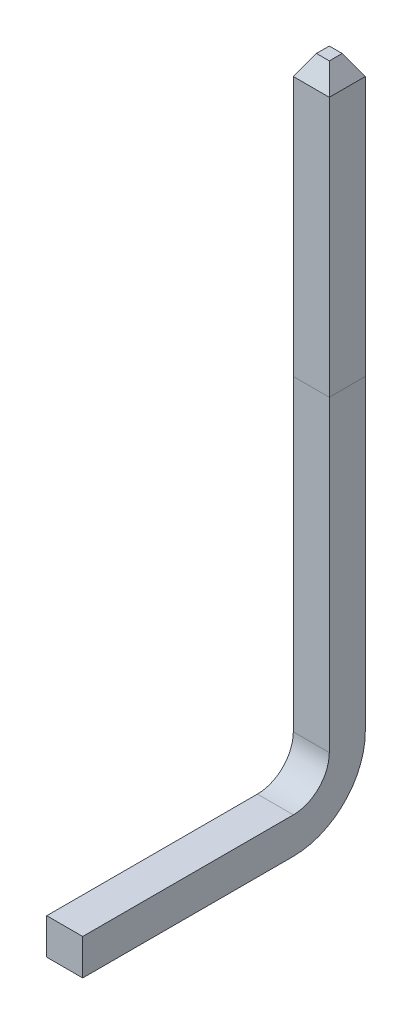
ISO-10303-21;
HEADER;
FILE_DESCRIPTION(('STEP AP214'),'2;1');
FILE_NAME('part.step','',(''),(''),'','','');
FILE_SCHEMA(('AUTOMOTIVE_DESIGN { 1 0 10303 214 1 1 1 1 }'));
ENDSEC;
DATA;
#1=APPLICATION_CONTEXT('core data for automotive mechanical design processes');
#2=APPLICATION_PROTOCOL_DEFINITION('international standard','automotive_design',2000,#1);
#3=PRODUCT_CONTEXT('',#1,'mechanical');
#4=PRODUCT('Part','Part','',(#3));
#5=PRODUCT_RELATED_PRODUCT_CATEGORY('part','',(#4));
#6=PRODUCT_DEFINITION_FORMATION('','',#4);
#7=PRODUCT_DEFINITION_CONTEXT('part definition',#1,'design');
#8=PRODUCT_DEFINITION('design','',#6,#7);
#9=PRODUCT_DEFINITION_SHAPE('','',#8);
#10=(LENGTH_UNIT() NAMED_UNIT(*) SI_UNIT(.MILLI.,.METRE.));
#11=(NAMED_UNIT(*) PLANE_ANGLE_UNIT() SI_UNIT($,.RADIAN.));
#12=(NAMED_UNIT(*) SI_UNIT($,.STERADIAN.) SOLID_ANGLE_UNIT());
#13=UNCERTAINTY_MEASURE_WITH_UNIT(LENGTH_MEASURE(1.E-05),#10,'distance_accuracy_value','');
#14=(GEOMETRIC_REPRESENTATION_CONTEXT(3) GLOBAL_UNCERTAINTY_ASSIGNED_CONTEXT((#13)) GLOBAL_UNIT_ASSIGNED_CONTEXT((#10,
#11,#12)) REPRESENTATION_CONTEXT('',''));
#15=CARTESIAN_POINT('',(0.,0.,0.));
#16=DIRECTION('',(0.,0.,1.));
#17=DIRECTION('',(1.,0.,0.));
#18=AXIS2_PLACEMENT_3D('',#15,#16,#17);
#19=CARTESIAN_POINT('',(0.945261,4.20515324442206,-8.33901828310207));
#20=DIRECTION('',(0.,0.,1.));
#21=DIRECTION('',(0.,-1.,0.));
#22=AXIS2_PLACEMENT_3D('',#19,#20,#21);
#23=PLANE('',#22);
#24=DIRECTION('',(-1.,0.,0.));
#25=VECTOR('',#24,1.);
#26=CARTESIAN_POINT('',(0.945261,10.6006192444221,-8.33901828310206));
#27=LINE('',#26,#25);
#28=CARTESIAN_POINT('',(0.945261,10.6006192444221,-8.33901828310206));
#29=VERTEX_POINT('',#28);
#30=CARTESIAN_POINT('',(0.197739,10.6006192444221,-8.33901828310206));
#31=VERTEX_POINT('',#30);
#32=EDGE_CURVE('E170',#29,#31,#27,.T.);
#33=ORIENTED_EDGE('',*,*,#32,.F.);
#34=DIRECTION('',(0.,1.,0.));
#35=VECTOR('',#34,1.);
#36=CARTESIAN_POINT('',(0.945261,4.20515324442206,-8.33901828310207));
#37=LINE('',#36,#35);
#38=CARTESIAN_POINT('',(0.945261,4.20515324442206,-8.33901828310207));
#39=VERTEX_POINT('',#38);
#40=EDGE_CURVE('E233',#39,#29,#37,.T.);
#41=ORIENTED_EDGE('',*,*,#40,.F.);
#42=DIRECTION('',(-1.,0.,0.));
#43=VECTOR('',#42,1.);
#44=CARTESIAN_POINT('',(0.945261,4.20515324442206,-8.33901828310207));
#45=LINE('',#44,#43);
#46=CARTESIAN_POINT('',(0.197739,4.20515324442206,-8.33901828310207));
#47=VERTEX_POINT('',#46);
#48=EDGE_CURVE('E162',#39,#47,#45,.T.);
#49=ORIENTED_EDGE('',*,*,#48,.T.);
#50=DIRECTION('',(0.,1.,0.));
#51=VECTOR('',#50,1.);
#52=CARTESIAN_POINT('',(0.197739,4.20515324442206,-8.33901828310207));
#53=LINE('',#52,#51);
#54=EDGE_CURVE('E212',#47,#31,#53,.T.);
#55=ORIENTED_EDGE('',*,*,#54,.T.);
#56=EDGE_LOOP('',(#33,#41,#49,#55));
#57=FACE_BOUND('',#56,.T.);
#58=ADVANCED_FACE('F40',(#57),#23,.F.);
#59=CARTESIAN_POINT('',(0.197739,4.20515324442206,-6.84397428310207));
#60=DIRECTION('',(1.,0.,0.));
#61=DIRECTION('',(0.,0.,-1.));
#62=AXIS2_PLACEMENT_3D('',#59,#60,#61);
#63=PLANE('',#62);
#64=DIRECTION('',(0.,0.,1.));
#65=VECTOR('',#64,1.);
#66=CARTESIAN_POINT('',(0.197739,10.6006192444221,-6.84397428310207));
#67=LINE('',#66,#65);
#68=CARTESIAN_POINT('',(0.197739,10.6006192444221,-7.59149628310206));
#69=VERTEX_POINT('',#68);
#70=EDGE_CURVE('E169',#31,#69,#67,.T.);
#71=ORIENTED_EDGE('',*,*,#70,.F.);
#72=ORIENTED_EDGE('',*,*,#54,.F.);
#73=CARTESIAN_POINT('',(0.197739,4.20515324442206,-6.84397428310207));
#74=DIRECTION('',(1.,0.,0.));
#75=DIRECTION('',(0.,0.,-1.));
#76=AXIS2_PLACEMENT_3D('',#73,#74,#75);
#77=CIRCLE('',#76,1.495044);
#78=CARTESIAN_POINT('',(0.197739,2.71010924442206,-6.84397428310207));
#79=VERTEX_POINT('',#78);
#80=EDGE_CURVE('E205',#79,#47,#77,.T.);
#81=ORIENTED_EDGE('',*,*,#80,.F.);
#82=DIRECTION('',(0.,0.,-1.));
#83=VECTOR('',#82,1.);
#84=CARTESIAN_POINT('',(0.197739,2.71010924442206,-2.46681768310206));
#85=LINE('',#84,#83);
#86=CARTESIAN_POINT('',(0.197739,2.71010924442206,-2.46681768310206));
#87=VERTEX_POINT('',#86);
#88=EDGE_CURVE('E203',#87,#79,#85,.T.);
#89=ORIENTED_EDGE('',*,*,#88,.F.);
#90=DIRECTION('',(0.,-1.,0.));
#91=VECTOR('',#90,1.);
#92=CARTESIAN_POINT('',(0.197739,3.45763124442206,-2.46681768310206));
#93=LINE('',#92,#91);
#94=CARTESIAN_POINT('',(0.197739,3.45763124442206,-2.46681768310206));
#95=VERTEX_POINT('',#94);
#96=EDGE_CURVE('E155',#95,#87,#93,.T.);
#97=ORIENTED_EDGE('',*,*,#96,.F.);
#98=DIRECTION('',(0.,0.,1.));
#99=VECTOR('',#98,1.);
#100=CARTESIAN_POINT('',(0.197739,3.45763124442206,-6.84397428310207));
#101=LINE('',#100,#99);
#102=CARTESIAN_POINT('',(0.197739,3.45763124442206,-6.84397428310207));
#103=VERTEX_POINT('',#102);
#104=EDGE_CURVE('E151',#103,#95,#101,.T.);
#105=ORIENTED_EDGE('',*,*,#104,.F.);
#106=CARTESIAN_POINT('',(0.197739,4.20515324442206,-6.84397428310207));
#107=DIRECTION('',(-1.,0.,0.));
#108=DIRECTION('',(0.,0.,-1.));
#109=AXIS2_PLACEMENT_3D('',#106,#107,#108);
#110=CIRCLE('',#109,0.747521999999998);
#111=CARTESIAN_POINT('',(0.197739,4.20515324442206,-7.59149628310206));
#112=VERTEX_POINT('',#111);
#113=EDGE_CURVE('E218',#112,#103,#110,.T.);
#114=ORIENTED_EDGE('',*,*,#113,.F.);
#115=DIRECTION('',(0.,-1.,0.));
#116=VECTOR('',#115,1.);
#117=CARTESIAN_POINT('',(0.197739,16.4146792444221,-7.59149628310206));
#118=LINE('',#117,#116);
#119=EDGE_CURVE('E215',#69,#112,#118,.T.);
#120=ORIENTED_EDGE('',*,*,#119,.F.);
#121=EDGE_LOOP('',(#71,#72,#81,#89,#97,#105,#114,#120));
#122=FACE_BOUND('',#121,.T.);
#123=ADVANCED_FACE('F238',(#122),#63,.F.);
#124=CARTESIAN_POINT('',(0.945261,16.4146792444221,-7.59149628310206));
#125=DIRECTION('',(0.,0.,-1.));
#126=DIRECTION('',(0.,1.,0.));
#127=AXIS2_PLACEMENT_3D('',#124,#125,#126);
#128=PLANE('',#127);
#129=DIRECTION('',(1.,0.,0.));
#130=VECTOR('',#129,1.);
#131=CARTESIAN_POINT('',(0.945261,10.6006192444221,-7.59149628310206));
#132=LINE('',#131,#130);
#133=CARTESIAN_POINT('',(0.945261,10.6006192444221,-7.59149628310206));
#134=VERTEX_POINT('',#133);
#135=EDGE_CURVE('E160',#69,#134,#132,.T.);
#136=ORIENTED_EDGE('',*,*,#135,.F.);
#137=ORIENTED_EDGE('',*,*,#119,.T.);
#138=DIRECTION('',(-1.,0.,0.));
#139=VECTOR('',#138,1.);
#140=CARTESIAN_POINT('',(0.945261,4.20515324442206,-7.59149628310206));
#141=LINE('',#140,#139);
#142=CARTESIAN_POINT('',(0.945261,4.20515324442206,-7.59149628310206));
#143=VERTEX_POINT('',#142);
#144=EDGE_CURVE('E226',#143,#112,#141,.T.);
#145=ORIENTED_EDGE('',*,*,#144,.F.);
#146=DIRECTION('',(0.,-1.,0.));
#147=VECTOR('',#146,1.);
#148=CARTESIAN_POINT('',(0.945261,16.4146792444221,-7.59149628310206));
#149=LINE('',#148,#147);
#150=EDGE_CURVE('E421',#134,#143,#149,.T.);
#151=ORIENTED_EDGE('',*,*,#150,.F.);
#152=EDGE_LOOP('',(#136,#137,#145,#151));
#153=FACE_BOUND('',#152,.T.);
#154=ADVANCED_FACE('F272',(#153),#128,.F.);
#155=CARTESIAN_POINT('',(0.945261,4.20515324442206,-6.84397428310207));
#156=DIRECTION('',(1.,0.,0.));
#157=DIRECTION('',(0.,0.,-1.));
#158=AXIS2_PLACEMENT_3D('',#155,#156,#157);
#159=PLANE('',#158);
#160=ORIENTED_EDGE('',*,*,#40,.T.);
#161=DIRECTION('',(0.,0.,1.));
#162=VECTOR('',#161,1.);
#163=CARTESIAN_POINT('',(0.945261,10.6006192444221,-6.84397428310207));
#164=LINE('',#163,#162);
#165=EDGE_CURVE('E156',#29,#134,#164,.T.);
#166=ORIENTED_EDGE('',*,*,#165,.T.);
#167=ORIENTED_EDGE('',*,*,#150,.T.);
#168=CARTESIAN_POINT('',(0.945261,4.20515324442206,-6.84397428310207));
#169=DIRECTION('',(-1.,0.,0.));
#170=DIRECTION('',(0.,0.,-1.));
#171=AXIS2_PLACEMENT_3D('',#168,#169,#170);
#172=CIRCLE('',#171,0.747521999999998);
#173=CARTESIAN_POINT('',(0.945261,3.45763124442206,-6.84397428310207));
#174=VERTEX_POINT('',#173);
#175=EDGE_CURVE('E428',#143,#174,#172,.T.);
#176=ORIENTED_EDGE('',*,*,#175,.T.);
#177=DIRECTION('',(0.,0.,1.));
#178=VECTOR('',#177,1.);
#179=CARTESIAN_POINT('',(0.945261,3.45763124442206,-6.84397428310207));
#180=LINE('',#179,#178);
#181=CARTESIAN_POINT('',(0.945261,3.45763124442206,-2.46681768310206));
#182=VERTEX_POINT('',#181);
#183=EDGE_CURVE('E147',#174,#182,#180,.T.);
#184=ORIENTED_EDGE('',*,*,#183,.T.);
#185=DIRECTION('',(0.,-1.,0.));
#186=VECTOR('',#185,1.);
#187=CARTESIAN_POINT('',(0.945261,3.45763124442206,-2.46681768310206));
#188=LINE('',#187,#186);
#189=CARTESIAN_POINT('',(0.945261,2.71010924442206,-2.46681768310206));
#190=VERTEX_POINT('',#189);
#191=EDGE_CURVE('E141',#182,#190,#188,.T.);
#192=ORIENTED_EDGE('',*,*,#191,.T.);
#193=DIRECTION('',(0.,0.,-1.));
#194=VECTOR('',#193,1.);
#195=CARTESIAN_POINT('',(0.945261,2.71010924442206,-2.46681768310206));
#196=LINE('',#195,#194);
#197=CARTESIAN_POINT('',(0.945261,2.71010924442206,-6.84397428310207));
#198=VERTEX_POINT('',#197);
#199=EDGE_CURVE('E130',#190,#198,#196,.T.);
#200=ORIENTED_EDGE('',*,*,#199,.T.);
#201=CARTESIAN_POINT('',(0.945261,4.20515324442206,-6.84397428310207));
#202=DIRECTION('',(1.,0.,0.));
#203=DIRECTION('',(0.,0.,-1.));
#204=AXIS2_PLACEMENT_3D('',#201,#202,#203);
#205=CIRCLE('',#204,1.495044);
#206=EDGE_CURVE('E140',#198,#39,#205,.T.);
#207=ORIENTED_EDGE('',*,*,#206,.T.);
#208=EDGE_LOOP('',(#160,#166,#167,#176,#184,#192,#200,#207));
#209=FACE_BOUND('',#208,.T.);
#210=ADVANCED_FACE('F145',(#209),#159,.T.);
#211=CARTESIAN_POINT('',(0.945261,3.45763124442206,-2.46681768310206));
#212=DIRECTION('',(0.,0.,-1.));
#213=DIRECTION('',(-1.,0.,0.));
#214=AXIS2_PLACEMENT_3D('',#211,#212,#213);
#215=PLANE('',#214);
#216=ORIENTED_EDGE('',*,*,#96,.T.);
#217=DIRECTION('',(-1.,0.,0.));
#218=VECTOR('',#217,1.);
#219=CARTESIAN_POINT('',(0.945261,2.71010924442206,-2.46681768310206));
#220=LINE('',#219,#218);
#221=EDGE_CURVE('E134',#190,#87,#220,.T.);
#222=ORIENTED_EDGE('',*,*,#221,.F.);
#223=ORIENTED_EDGE('',*,*,#191,.F.);
#224=DIRECTION('',(-1.,0.,0.));
#225=VECTOR('',#224,1.);
#226=CARTESIAN_POINT('',(0.945261,3.45763124442206,-2.46681768310206));
#227=LINE('',#226,#225);
#228=EDGE_CURVE('E221',#182,#95,#227,.T.);
#229=ORIENTED_EDGE('',*,*,#228,.T.);
#230=EDGE_LOOP('',(#216,#222,#223,#229));
#231=FACE_BOUND('',#230,.T.);
#232=ADVANCED_FACE('F153',(#231),#215,.F.);
#233=CARTESIAN_POINT('',(0.945261,2.71010924442206,-2.46681768310206));
#234=DIRECTION('',(0.,1.,0.));
#235=DIRECTION('',(0.,0.,1.));
#236=AXIS2_PLACEMENT_3D('',#233,#234,#235);
#237=PLANE('',#236);
#238=ORIENTED_EDGE('',*,*,#88,.T.);
#239=DIRECTION('',(-1.,0.,0.));
#240=VECTOR('',#239,1.);
#241=CARTESIAN_POINT('',(0.945261,2.71010924442206,-6.84397428310207));
#242=LINE('',#241,#240);
#243=EDGE_CURVE('E137',#198,#79,#242,.T.);
#244=ORIENTED_EDGE('',*,*,#243,.F.);
#245=ORIENTED_EDGE('',*,*,#199,.F.);
#246=ORIENTED_EDGE('',*,*,#221,.T.);
#247=EDGE_LOOP('',(#238,#244,#245,#246));
#248=FACE_BOUND('',#247,.T.);
#249=ADVANCED_FACE('F132',(#248),#237,.F.);
#250=CARTESIAN_POINT('',(0.945261,4.20515324442206,-6.84397428310207));
#251=DIRECTION('',(-1.,0.,0.));
#252=DIRECTION('',(0.,0.,1.));
#253=AXIS2_PLACEMENT_3D('',#250,#251,#252);
#254=CYLINDRICAL_SURFACE('',#253,1.495044);
#255=ORIENTED_EDGE('',*,*,#80,.T.);
#256=ORIENTED_EDGE('',*,*,#48,.F.);
#257=ORIENTED_EDGE('',*,*,#206,.F.);
#258=ORIENTED_EDGE('',*,*,#243,.T.);
#259=EDGE_LOOP('',(#255,#256,#257,#258));
#260=FACE_BOUND('',#259,.T.);
#261=ADVANCED_FACE('F277',(#260),#254,.T.);
#262=CARTESIAN_POINT('',(0.197739,15.9993892444221,-8.33901828310206));
#263=VERTEX_POINT('',#262);
#264=EDGE_CURVE('E211',#31,#263,#53,.T.);
#265=ORIENTED_EDGE('',*,*,#264,.T.);
#266=DIRECTION('',(1.,0.,0.));
#267=VECTOR('',#266,1.);
#268=CARTESIAN_POINT('',(0.945261,15.9993892444221,-8.33901828310206));
#269=LINE('',#268,#267);
#270=CARTESIAN_POINT('',(0.945261,15.9993892444221,-8.33901828310206));
#271=VERTEX_POINT('',#270);
#272=EDGE_CURVE('E185',#263,#271,#269,.T.);
#273=ORIENTED_EDGE('',*,*,#272,.T.);
#274=EDGE_CURVE('E424',#29,#271,#37,.T.);
#275=ORIENTED_EDGE('',*,*,#274,.F.);
#276=ORIENTED_EDGE('',*,*,#32,.T.);
#277=EDGE_LOOP('',(#265,#273,#275,#276));
#278=FACE_BOUND('',#277,.T.);
#279=ADVANCED_FACE('F248',(#278),#23,.F.);
#280=CARTESIAN_POINT('',(0.945261,16.4146792444221,-8.33901828310206));
#281=DIRECTION('',(0.,-1.,0.));
#282=DIRECTION('',(0.,0.,-1.));
#283=AXIS2_PLACEMENT_3D('',#280,#281,#282);
#284=PLANE('',#283);
#285=DIRECTION('',(0.,0.,-1.));
#286=VECTOR('',#285,1.);
#287=CARTESIAN_POINT('',(0.705493206708241,16.4146792444221,-8.33901828310206));
#288=LINE('',#287,#286);
#289=CARTESIAN_POINT('',(0.705493206708241,16.4146792444221,-7.83126407639382));
#290=VERTEX_POINT('',#289);
#291=CARTESIAN_POINT('',(0.705493206708241,16.4146792444221,-8.09925048981031));
#292=VERTEX_POINT('',#291);
#293=EDGE_CURVE('E180',#290,#292,#288,.T.);
#294=ORIENTED_EDGE('',*,*,#293,.T.);
#295=DIRECTION('',(-1.,0.,0.));
#296=VECTOR('',#295,1.);
#297=CARTESIAN_POINT('',(0.945261,16.4146792444221,-8.09925048981031));
#298=LINE('',#297,#296);
#299=CARTESIAN_POINT('',(0.437506793291759,16.4146792444221,-8.09925048981031));
#300=VERTEX_POINT('',#299);
#301=EDGE_CURVE('E182',#292,#300,#298,.T.);
#302=ORIENTED_EDGE('',*,*,#301,.T.);
#303=DIRECTION('',(0.,0.,1.));
#304=VECTOR('',#303,1.);
#305=CARTESIAN_POINT('',(0.437506793291759,16.4146792444221,-8.33901828310206));
#306=LINE('',#305,#304);
#307=CARTESIAN_POINT('',(0.437506793291759,16.4146792444221,-7.83126407639382));
#308=VERTEX_POINT('',#307);
#309=EDGE_CURVE('E173',#300,#308,#306,.T.);
#310=ORIENTED_EDGE('',*,*,#309,.T.);
#311=DIRECTION('',(1.,0.,0.));
#312=VECTOR('',#311,1.);
#313=CARTESIAN_POINT('',(0.945261,16.4146792444221,-7.83126407639382));
#314=LINE('',#313,#312);
#315=EDGE_CURVE('E178',#308,#290,#314,.T.);
#316=ORIENTED_EDGE('',*,*,#315,.T.);
#317=EDGE_LOOP('',(#294,#302,#310,#316));
#318=FACE_BOUND('',#317,.T.);
#319=ADVANCED_FACE('F258',(#318),#284,.F.);
#320=CARTESIAN_POINT('',(0.945261,15.9993892444221,-7.59149628310206));
#321=VERTEX_POINT('',#320);
#322=EDGE_CURVE('E422',#321,#134,#149,.T.);
#323=ORIENTED_EDGE('',*,*,#322,.F.);
#324=DIRECTION('',(-1.,0.,0.));
#325=VECTOR('',#324,1.);
#326=CARTESIAN_POINT('',(0.945261,15.9993892444221,-7.59149628310206));
#327=LINE('',#326,#325);
#328=CARTESIAN_POINT('',(0.197739,15.9993892444221,-7.59149628310206));
#329=VERTEX_POINT('',#328);
#330=EDGE_CURVE('E49',#321,#329,#327,.T.);
#331=ORIENTED_EDGE('',*,*,#330,.T.);
#332=EDGE_CURVE('E216',#329,#69,#118,.T.);
#333=ORIENTED_EDGE('',*,*,#332,.T.);
#334=ORIENTED_EDGE('',*,*,#135,.T.);
#335=EDGE_LOOP('',(#323,#331,#333,#334));
#336=FACE_BOUND('',#335,.T.);
#337=ADVANCED_FACE('F282',(#336),#128,.F.);
#338=CARTESIAN_POINT('',(0.945261,4.20515324442206,-6.84397428310207));
#339=DIRECTION('',(-1.,0.,0.));
#340=DIRECTION('',(0.,0.,1.));
#341=AXIS2_PLACEMENT_3D('',#338,#339,#340);
#342=CYLINDRICAL_SURFACE('',#341,0.747521999999998);
#343=ORIENTED_EDGE('',*,*,#113,.T.);
#344=DIRECTION('',(-1.,0.,0.));
#345=VECTOR('',#344,1.);
#346=CARTESIAN_POINT('',(0.945261,3.45763124442206,-6.84397428310207));
#347=LINE('',#346,#345);
#348=EDGE_CURVE('E223',#174,#103,#347,.T.);
#349=ORIENTED_EDGE('',*,*,#348,.F.);
#350=ORIENTED_EDGE('',*,*,#175,.F.);
#351=ORIENTED_EDGE('',*,*,#144,.T.);
#352=EDGE_LOOP('',(#343,#349,#350,#351));
#353=FACE_BOUND('',#352,.T.);
#354=ADVANCED_FACE('F336',(#353),#342,.F.);
#355=CARTESIAN_POINT('',(0.945261,3.45763124442206,-6.84397428310207));
#356=DIRECTION('',(0.,-1.,0.));
#357=DIRECTION('',(0.,0.,-1.));
#358=AXIS2_PLACEMENT_3D('',#355,#356,#357);
#359=PLANE('',#358);
#360=ORIENTED_EDGE('',*,*,#104,.T.);
#361=ORIENTED_EDGE('',*,*,#228,.F.);
#362=ORIENTED_EDGE('',*,*,#183,.F.);
#363=ORIENTED_EDGE('',*,*,#348,.T.);
#364=EDGE_LOOP('',(#360,#361,#362,#363));
#365=FACE_BOUND('',#364,.T.);
#366=ADVANCED_FACE('F325',(#365),#359,.F.);
#367=ORIENTED_EDGE('',*,*,#274,.T.);
#368=DIRECTION('',(0.,0.,1.));
#369=VECTOR('',#368,1.);
#370=CARTESIAN_POINT('',(0.945261,15.9993892444221,-7.59149628310206));
#371=LINE('',#370,#369);
#372=EDGE_CURVE('E64',#271,#321,#371,.T.);
#373=ORIENTED_EDGE('',*,*,#372,.T.);
#374=ORIENTED_EDGE('',*,*,#322,.T.);
#375=ORIENTED_EDGE('',*,*,#165,.F.);
#376=EDGE_LOOP('',(#367,#373,#374,#375));
#377=FACE_BOUND('',#376,.T.);
#378=ADVANCED_FACE('F317',(#377),#159,.T.);
#379=ORIENTED_EDGE('',*,*,#332,.F.);
#380=DIRECTION('',(0.,0.,-1.));
#381=VECTOR('',#380,1.);
#382=CARTESIAN_POINT('',(0.197739,15.9993892444221,-6.84397428310207));
#383=LINE('',#382,#381);
#384=EDGE_CURVE('E11',#329,#263,#383,.T.);
#385=ORIENTED_EDGE('',*,*,#384,.T.);
#386=ORIENTED_EDGE('',*,*,#264,.F.);
#387=ORIENTED_EDGE('',*,*,#70,.T.);
#388=EDGE_LOOP('',(#379,#385,#386,#387));
#389=FACE_BOUND('',#388,.T.);
#390=ADVANCED_FACE('F245',(#389),#63,.F.);
#391=CARTESIAN_POINT('',(0.945261,15.9993892444221,-7.59149628310206));
#392=DIRECTION('',(0.,-0.499999999999997,-0.866025403784441));
#393=DIRECTION('',(-1.,0.,0.));
#394=AXIS2_PLACEMENT_3D('',#391,#392,#393);
#395=PLANE('',#394);
#396=DIRECTION('',(0.447213595499956,0.774596669241486,-0.447213595499956));
#397=VECTOR('',#396,1.);
#398=CARTESIAN_POINT('',(0.539057634633406,16.5905704611772,-7.93281491773547));
#399=LINE('',#398,#397);
#400=EDGE_CURVE('E193',#329,#308,#399,.T.);
#401=ORIENTED_EDGE('',*,*,#400,.F.);
#402=ORIENTED_EDGE('',*,*,#330,.F.);
#403=DIRECTION('',(0.447213595499956,-0.774596669241486,0.447213595499956));
#404=VECTOR('',#403,1.);
#405=CARTESIAN_POINT('',(0.945261,15.9993892444221,-7.59149628310206));
#406=LINE('',#405,#404);
#407=EDGE_CURVE('E44',#290,#321,#406,.T.);
#408=ORIENTED_EDGE('',*,*,#407,.F.);
#409=ORIENTED_EDGE('',*,*,#315,.F.);
#410=EDGE_LOOP('',(#401,#402,#408,#409));
#411=FACE_BOUND('',#410,.T.);
#412=ADVANCED_FACE('F42',(#411),#395,.F.);
#413=CARTESIAN_POINT('',(0.945261,15.9993892444221,-6.84397428310207));
#414=DIRECTION('',(0.866025403784441,0.499999999999997,0.));
#415=DIRECTION('',(0.,0.,-1.));
#416=AXIS2_PLACEMENT_3D('',#413,#414,#415);
#417=PLANE('',#416);
#418=ORIENTED_EDGE('',*,*,#407,.T.);
#419=ORIENTED_EDGE('',*,*,#372,.F.);
#420=DIRECTION('',(0.447213595499956,-0.774596669241486,-0.447213595499956));
#421=VECTOR('',#420,1.);
#422=CARTESIAN_POINT('',(0.646252200000003,16.5172876779323,-8.04000948310207));
#423=LINE('',#422,#421);
#424=EDGE_CURVE('E192',#292,#271,#423,.T.);
#425=ORIENTED_EDGE('',*,*,#424,.F.);
#426=ORIENTED_EDGE('',*,*,#293,.F.);
#427=EDGE_LOOP('',(#418,#419,#425,#426));
#428=FACE_BOUND('',#427,.T.);
#429=ADVANCED_FACE('F259',(#428),#417,.T.);
#430=CARTESIAN_POINT('',(0.437506793291759,16.4146792444221,-8.33901828310206));
#431=DIRECTION('',(0.866025403784441,-0.499999999999997,0.));
#432=DIRECTION('',(0.,0.,1.));
#433=AXIS2_PLACEMENT_3D('',#430,#431,#432);
#434=PLANE('',#433);
#435=ORIENTED_EDGE('',*,*,#400,.T.);
#436=ORIENTED_EDGE('',*,*,#309,.F.);
#437=DIRECTION('',(-0.447213595499956,-0.774596669241486,-0.447213595499956));
#438=VECTOR('',#437,1.);
#439=CARTESIAN_POINT('',(0.389553234633408,16.3316212444221,-8.14720404846866));
#440=LINE('',#439,#438);
#441=EDGE_CURVE('E190',#263,#300,#440,.F.);
#442=ORIENTED_EDGE('',*,*,#441,.F.);
#443=ORIENTED_EDGE('',*,*,#384,.F.);
#444=EDGE_LOOP('',(#435,#436,#442,#443));
#445=FACE_BOUND('',#444,.T.);
#446=ADVANCED_FACE('F255',(#445),#434,.F.);
#447=CARTESIAN_POINT('',(0.945261,16.4146792444221,-8.09925048981031));
#448=DIRECTION('',(0.,-0.499999999999997,0.866025403784441));
#449=DIRECTION('',(-1.,0.,0.));
#450=AXIS2_PLACEMENT_3D('',#447,#448,#449);
#451=PLANE('',#450);
#452=ORIENTED_EDGE('',*,*,#424,.T.);
#453=ORIENTED_EDGE('',*,*,#272,.F.);
#454=ORIENTED_EDGE('',*,*,#441,.T.);
#455=ORIENTED_EDGE('',*,*,#301,.F.);
#456=EDGE_LOOP('',(#452,#453,#454,#455));
#457=FACE_BOUND('',#456,.T.);
#458=ADVANCED_FACE('F252',(#457),#451,.F.);
#459=CLOSED_SHELL('',(#58,#123,#154,#210,#232,#249,#261,#279,#319,#337,#354,#366,#378,#390,#412,
#429,#446,#458));
#460=MANIFOLD_SOLID_BREP('B2',#459);
#461=ADVANCED_BREP_SHAPE_REPRESENTATION('',(#18,#460),#14);
#462=SHAPE_DEFINITION_REPRESENTATION(#9,#461);
ENDSEC;
END-ISO-10303-21;
